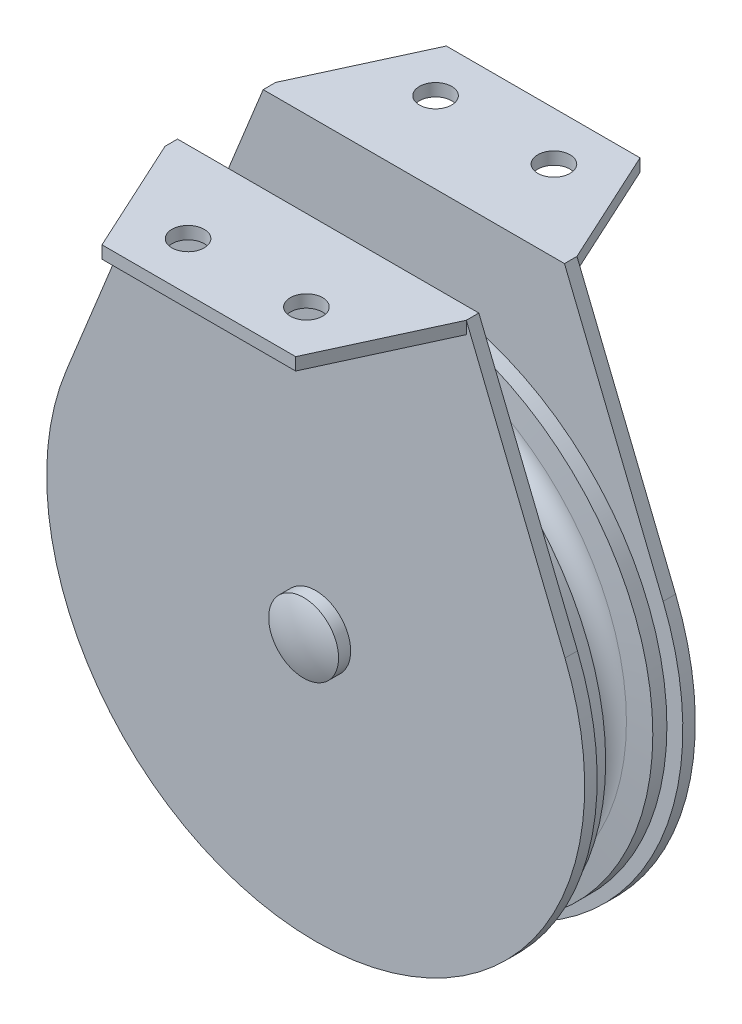
ISO-10303-21;
HEADER;
FILE_DESCRIPTION(('STEP AP214'),'2;1');
FILE_NAME('part.step','',(''),(''),'','','');
FILE_SCHEMA(('AUTOMOTIVE_DESIGN { 1 0 10303 214 1 1 1 1 }'));
ENDSEC;
DATA;
#1=APPLICATION_CONTEXT('core data for automotive mechanical design processes');
#2=APPLICATION_PROTOCOL_DEFINITION('international standard','automotive_design',2000,#1);
#3=PRODUCT_CONTEXT('',#1,'mechanical');
#4=PRODUCT('Part','Part','',(#3));
#5=PRODUCT_RELATED_PRODUCT_CATEGORY('part','',(#4));
#6=PRODUCT_DEFINITION_FORMATION('','',#4);
#7=PRODUCT_DEFINITION_CONTEXT('part definition',#1,'design');
#8=PRODUCT_DEFINITION('design','',#6,#7);
#9=PRODUCT_DEFINITION_SHAPE('','',#8);
#10=(LENGTH_UNIT() NAMED_UNIT(*) SI_UNIT(.MILLI.,.METRE.));
#11=(NAMED_UNIT(*) PLANE_ANGLE_UNIT() SI_UNIT($,.RADIAN.));
#12=(NAMED_UNIT(*) SI_UNIT($,.STERADIAN.) SOLID_ANGLE_UNIT());
#13=UNCERTAINTY_MEASURE_WITH_UNIT(LENGTH_MEASURE(1.E-05),#10,'distance_accuracy_value','');
#14=(GEOMETRIC_REPRESENTATION_CONTEXT(3) GLOBAL_UNCERTAINTY_ASSIGNED_CONTEXT((#13)) GLOBAL_UNIT_ASSIGNED_CONTEXT((#10,
#11,#12)) REPRESENTATION_CONTEXT('',''));
#15=CARTESIAN_POINT('',(0.,0.,0.));
#16=DIRECTION('',(0.,0.,1.));
#17=DIRECTION('',(1.,0.,0.));
#18=AXIS2_PLACEMENT_3D('',#15,#16,#17);
#19=CARTESIAN_POINT('',(0.,0.,-9.93775));
#20=DIRECTION('',(0.,0.,1.));
#21=DIRECTION('',(1.,0.,0.));
#22=AXIS2_PLACEMENT_3D('',#19,#20,#21);
#23=CYLINDRICAL_SURFACE('',#22,6.35);
#24=CARTESIAN_POINT('',(0.,0.,-9.93775));
#25=DIRECTION('',(0.,0.,-1.));
#26=DIRECTION('',(-1.,0.,0.));
#27=AXIS2_PLACEMENT_3D('',#24,#25,#26);
#28=CIRCLE('',#27,6.35);
#29=CARTESIAN_POINT('',(-6.35,0.,-9.93775));
#30=VERTEX_POINT('',#29);
#31=EDGE_CURVE('E11',#30,#30,#28,.T.);
#32=ORIENTED_EDGE('',*,*,#31,.F.);
#33=EDGE_LOOP('',(#32));
#34=FACE_BOUND('',#33,.T.);
#35=CARTESIAN_POINT('',(0.,0.,-8.15975));
#36=DIRECTION('',(0.,0.,-1.));
#37=DIRECTION('',(-1.,0.,0.));
#38=AXIS2_PLACEMENT_3D('',#35,#36,#37);
#39=CIRCLE('',#38,6.35);
#40=CARTESIAN_POINT('',(-6.35,0.,-8.15975));
#41=VERTEX_POINT('',#40);
#42=EDGE_CURVE('E50',#41,#41,#39,.T.);
#43=ORIENTED_EDGE('',*,*,#42,.T.);
#44=EDGE_LOOP('',(#43));
#45=FACE_BOUND('',#44,.T.);
#46=ADVANCED_FACE('F43',(#34,#45),#23,.T.);
#47=CARTESIAN_POINT('',(0.,0.,-6.83080897435898));
#48=DIRECTION('',(0.,0.,1.));
#49=DIRECTION('',(1.,0.,0.));
#50=AXIS2_PLACEMENT_3D('',#47,#48,#49);
#51=SPHERICAL_SURFACE('',#50,7.06934102564103);
#52=ORIENTED_EDGE('',*,*,#31,.T.);
#53=EDGE_LOOP('',(#52));
#54=FACE_BOUND('',#53,.T.);
#55=ADVANCED_FACE('F45',(#54),#51,.T.);
#56=CARTESIAN_POINT('',(0.,0.,-8.15975));
#57=DIRECTION('',(0.,0.,-1.));
#58=DIRECTION('',(-1.,0.,0.));
#59=AXIS2_PLACEMENT_3D('',#56,#57,#58);
#60=PLANE('',#59);
#61=ORIENTED_EDGE('',*,*,#42,.F.);
#62=EDGE_LOOP('',(#61));
#63=FACE_BOUND('',#62,.T.);
#64=ADVANCED_FACE('F57',(#63),#60,.F.);
#65=CLOSED_SHELL('',(#46,#55,#64));
#66=MANIFOLD_SOLID_BREP('B2',#65);
#67=CARTESIAN_POINT('',(-22.225,50.8,-8.15975));
#68=DIRECTION('',(0.926691720270189,-0.375822372381793,0.));
#69=DIRECTION('',(0.375822372381793,0.926691720270189,0.));
#70=AXIS2_PLACEMENT_3D('',#67,#68,#69);
#71=PLANE('',#70);
#72=DIRECTION('',(-0.375822372381793,-0.926691720270188,0.));
#73=VECTOR('',#72,1.);
#74=CARTESIAN_POINT('',(-22.225,50.8,-6.31825));
#75=LINE('',#74,#73);
#76=CARTESIAN_POINT('',(-22.225,50.8,-6.31825));
#77=VERTEX_POINT('',#76);
#78=CARTESIAN_POINT('',(-36.7780776482231,14.9154504039024,-6.31825));
#79=VERTEX_POINT('',#78);
#80=EDGE_CURVE('E171',#77,#79,#75,.T.);
#81=ORIENTED_EDGE('',*,*,#80,.F.);
#82=DIRECTION('',(0.,0.,1.));
#83=VECTOR('',#82,1.);
#84=CARTESIAN_POINT('',(-22.225,50.8,-8.15975));
#85=LINE('',#84,#83);
#86=CARTESIAN_POINT('',(-22.225,50.8,-8.15975));
#87=VERTEX_POINT('',#86);
#88=EDGE_CURVE('E209',#87,#77,#85,.T.);
#89=ORIENTED_EDGE('',*,*,#88,.F.);
#90=DIRECTION('',(-0.375822372381793,-0.926691720270188,0.));
#91=VECTOR('',#90,1.);
#92=CARTESIAN_POINT('',(-22.225,50.8,-8.15975));
#93=LINE('',#92,#91);
#94=CARTESIAN_POINT('',(-36.7780776482231,14.9154504039024,-8.15975));
#95=VERTEX_POINT('',#94);
#96=EDGE_CURVE('E202',#87,#95,#93,.T.);
#97=ORIENTED_EDGE('',*,*,#96,.T.);
#98=DIRECTION('',(0.,0.,1.));
#99=VECTOR('',#98,1.);
#100=CARTESIAN_POINT('',(-36.7780776482231,14.9154504039024,-8.15975));
#101=LINE('',#100,#99);
#102=EDGE_CURVE('E41',#95,#79,#101,.T.);
#103=ORIENTED_EDGE('',*,*,#102,.T.);
#104=EDGE_LOOP('',(#81,#89,#97,#103));
#105=FACE_BOUND('',#104,.T.);
#106=ADVANCED_FACE('F92',(#105),#71,.F.);
#107=CARTESIAN_POINT('',(0.,0.,-8.15975));
#108=DIRECTION('',(0.,0.,1.));
#109=DIRECTION('',(-1.,0.,0.));
#110=AXIS2_PLACEMENT_3D('',#107,#108,#109);
#111=CYLINDRICAL_SURFACE('',#110,39.6875);
#112=CARTESIAN_POINT('',(0.,0.,-6.31825));
#113=DIRECTION('',(0.,0.,1.));
#114=DIRECTION('',(1.,0.,0.));
#115=AXIS2_PLACEMENT_3D('',#112,#113,#114);
#116=CIRCLE('',#115,39.6875);
#117=CARTESIAN_POINT('',(36.7780776482231,14.9154504039024,-6.31825));
#118=VERTEX_POINT('',#117);
#119=EDGE_CURVE('E211',#79,#118,#116,.T.);
#120=ORIENTED_EDGE('',*,*,#119,.F.);
#121=ORIENTED_EDGE('',*,*,#102,.F.);
#122=CARTESIAN_POINT('',(0.,0.,-8.15975));
#123=DIRECTION('',(0.,0.,1.));
#124=DIRECTION('',(1.,0.,0.));
#125=AXIS2_PLACEMENT_3D('',#122,#123,#124);
#126=CIRCLE('',#125,39.6875);
#127=CARTESIAN_POINT('',(36.7780776482231,14.9154504039024,-8.15975));
#128=VERTEX_POINT('',#127);
#129=EDGE_CURVE('E136',#95,#128,#126,.T.);
#130=ORIENTED_EDGE('',*,*,#129,.T.);
#131=DIRECTION('',(0.,0.,1.));
#132=VECTOR('',#131,1.);
#133=CARTESIAN_POINT('',(36.7780776482231,14.9154504039024,-8.15975));
#134=LINE('',#133,#132);
#135=EDGE_CURVE('E100',#128,#118,#134,.T.);
#136=ORIENTED_EDGE('',*,*,#135,.T.);
#137=EDGE_LOOP('',(#120,#121,#130,#136));
#138=FACE_BOUND('',#137,.T.);
#139=ADVANCED_FACE('F222',(#138),#111,.T.);
#140=CARTESIAN_POINT('',(36.7780776482231,14.9154504039024,-8.15975));
#141=DIRECTION('',(-0.926691720270189,-0.375822372381793,0.));
#142=DIRECTION('',(0.375822372381793,-0.926691720270189,0.));
#143=AXIS2_PLACEMENT_3D('',#140,#141,#142);
#144=PLANE('',#143);
#145=DIRECTION('',(-0.375822372381792,0.926691720270188,0.));
#146=VECTOR('',#145,1.);
#147=CARTESIAN_POINT('',(36.7780776482231,14.9154504039024,-6.31825));
#148=LINE('',#147,#146);
#149=CARTESIAN_POINT('',(22.225,50.8,-6.31825));
#150=VERTEX_POINT('',#149);
#151=EDGE_CURVE('E214',#118,#150,#148,.T.);
#152=ORIENTED_EDGE('',*,*,#151,.F.);
#153=ORIENTED_EDGE('',*,*,#135,.F.);
#154=DIRECTION('',(-0.375822372381792,0.926691720270188,0.));
#155=VECTOR('',#154,1.);
#156=CARTESIAN_POINT('',(36.7780776482231,14.9154504039024,-8.15975));
#157=LINE('',#156,#155);
#158=CARTESIAN_POINT('',(22.225,50.8,-8.15975000000001));
#159=VERTEX_POINT('',#158);
#160=EDGE_CURVE('E206',#128,#159,#157,.T.);
#161=ORIENTED_EDGE('',*,*,#160,.T.);
#162=DIRECTION('',(0.,0.,1.));
#163=VECTOR('',#162,1.);
#164=CARTESIAN_POINT('',(22.225,50.8,-8.15975));
#165=LINE('',#164,#163);
#166=EDGE_CURVE('E218',#159,#150,#165,.T.);
#167=ORIENTED_EDGE('',*,*,#166,.T.);
#168=EDGE_LOOP('',(#152,#153,#161,#167));
#169=FACE_BOUND('',#168,.T.);
#170=ADVANCED_FACE('F231',(#169),#144,.F.);
#171=CARTESIAN_POINT('',(22.225,50.8,-8.15975));
#172=DIRECTION('',(0.,-1.,0.));
#173=DIRECTION('',(0.,0.,1.));
#174=AXIS2_PLACEMENT_3D('',#171,#172,#173);
#175=PLANE('',#174);
#176=DIRECTION('',(-1.,0.,0.));
#177=VECTOR('',#176,1.);
#178=CARTESIAN_POINT('',(22.225,50.8,-6.31825));
#179=LINE('',#178,#177);
#180=EDGE_CURVE('E127',#150,#77,#179,.T.);
#181=ORIENTED_EDGE('',*,*,#180,.F.);
#182=ORIENTED_EDGE('',*,*,#166,.F.);
#183=DIRECTION('',(-0.418209335464118,0.,-0.908350676628064));
#184=VECTOR('',#183,1.);
#185=CARTESIAN_POINT('',(14.2875,50.8,-25.4));
#186=LINE('',#185,#184);
#187=CARTESIAN_POINT('',(14.2875,50.8,-25.4));
#188=VERTEX_POINT('',#187);
#189=EDGE_CURVE('E195',#159,#188,#186,.T.);
#190=ORIENTED_EDGE('',*,*,#189,.T.);
#191=DIRECTION('',(-1.,0.,0.));
#192=VECTOR('',#191,1.);
#193=CARTESIAN_POINT('',(14.2875,50.8,-25.4));
#194=LINE('',#193,#192);
#195=CARTESIAN_POINT('',(-14.2875,50.8,-25.4));
#196=VERTEX_POINT('',#195);
#197=EDGE_CURVE('E166',#188,#196,#194,.T.);
#198=ORIENTED_EDGE('',*,*,#197,.T.);
#199=DIRECTION('',(-0.418209335464118,0.,0.908350676628064));
#200=VECTOR('',#199,1.);
#201=CARTESIAN_POINT('',(-14.2875,50.8,-25.4));
#202=LINE('',#201,#200);
#203=EDGE_CURVE('E185',#196,#87,#202,.T.);
#204=ORIENTED_EDGE('',*,*,#203,.T.);
#205=ORIENTED_EDGE('',*,*,#88,.T.);
#206=EDGE_LOOP('',(#181,#182,#190,#198,#204,#205));
#207=FACE_BOUND('',#206,.T.);
#208=CARTESIAN_POINT('',(8.73125,50.8,-18.25625));
#209=DIRECTION('',(0.,1.,0.));
#210=DIRECTION('',(0.,0.,1.));
#211=AXIS2_PLACEMENT_3D('',#208,#209,#210);
#212=CIRCLE('',#211,2.38125);
#213=CARTESIAN_POINT('',(8.73125,50.8,-15.875));
#214=VERTEX_POINT('',#213);
#215=EDGE_CURVE('E189',#214,#214,#212,.T.);
#216=ORIENTED_EDGE('',*,*,#215,.F.);
#217=EDGE_LOOP('',(#216));
#218=FACE_BOUND('',#217,.T.);
#219=CARTESIAN_POINT('',(-8.73125,50.8,-18.25625));
#220=DIRECTION('',(0.,1.,0.));
#221=DIRECTION('',(0.,0.,1.));
#222=AXIS2_PLACEMENT_3D('',#219,#220,#221);
#223=CIRCLE('',#222,2.38125);
#224=CARTESIAN_POINT('',(-8.73125,50.8,-15.875));
#225=VERTEX_POINT('',#224);
#226=EDGE_CURVE('E337',#225,#225,#223,.T.);
#227=ORIENTED_EDGE('',*,*,#226,.F.);
#228=EDGE_LOOP('',(#227));
#229=FACE_BOUND('',#228,.T.);
#230=ADVANCED_FACE('F229',(#207,#218,#229),#175,.F.);
#231=CARTESIAN_POINT('',(0.,0.,-8.15975));
#232=DIRECTION('',(0.,0.,-1.));
#233=DIRECTION('',(1.,0.,0.));
#234=AXIS2_PLACEMENT_3D('',#231,#232,#233);
#235=PLANE('',#234);
#236=DIRECTION('',(0.,1.,0.));
#237=VECTOR('',#236,1.);
#238=CARTESIAN_POINT('',(22.225,48.9585,-8.15975000000001));
#239=LINE('',#238,#237);
#240=CARTESIAN_POINT('',(22.225,48.9585,-8.15975000000001));
#241=VERTEX_POINT('',#240);
#242=EDGE_CURVE('E184',#241,#159,#239,.T.);
#243=ORIENTED_EDGE('',*,*,#242,.T.);
#244=ORIENTED_EDGE('',*,*,#160,.F.);
#245=ORIENTED_EDGE('',*,*,#129,.F.);
#246=ORIENTED_EDGE('',*,*,#96,.F.);
#247=DIRECTION('',(0.,1.,0.));
#248=VECTOR('',#247,1.);
#249=CARTESIAN_POINT('',(-22.225,48.9585,-8.15975000000001));
#250=LINE('',#249,#248);
#251=CARTESIAN_POINT('',(-22.225,48.9585,-8.15975000000001));
#252=VERTEX_POINT('',#251);
#253=EDGE_CURVE('E108',#252,#87,#250,.T.);
#254=ORIENTED_EDGE('',*,*,#253,.F.);
#255=DIRECTION('',(1.,0.,0.));
#256=VECTOR('',#255,1.);
#257=CARTESIAN_POINT('',(22.225,48.9585,-8.15975000000001));
#258=LINE('',#257,#256);
#259=EDGE_CURVE('E193',#252,#241,#258,.T.);
#260=ORIENTED_EDGE('',*,*,#259,.T.);
#261=EDGE_LOOP('',(#243,#244,#245,#246,#254,#260));
#262=FACE_BOUND('',#261,.T.);
#263=ADVANCED_FACE('F228',(#262),#235,.T.);
#264=CARTESIAN_POINT('',(0.,0.,-6.31825));
#265=DIRECTION('',(0.,0.,-1.));
#266=DIRECTION('',(1.,0.,0.));
#267=AXIS2_PLACEMENT_3D('',#264,#265,#266);
#268=PLANE('',#267);
#269=ORIENTED_EDGE('',*,*,#80,.T.);
#270=ORIENTED_EDGE('',*,*,#119,.T.);
#271=ORIENTED_EDGE('',*,*,#151,.T.);
#272=ORIENTED_EDGE('',*,*,#180,.T.);
#273=EDGE_LOOP('',(#269,#270,#271,#272));
#274=FACE_BOUND('',#273,.T.);
#275=ADVANCED_FACE('F224',(#274),#268,.F.);
#276=CARTESIAN_POINT('',(22.225,48.9585,-8.15975000000001));
#277=DIRECTION('',(0.,1.,0.));
#278=DIRECTION('',(0.,0.,-1.));
#279=AXIS2_PLACEMENT_3D('',#276,#277,#278);
#280=PLANE('',#279);
#281=CARTESIAN_POINT('',(8.73125,48.9585,-18.25625));
#282=DIRECTION('',(0.,1.,0.));
#283=DIRECTION('',(0.,0.,1.));
#284=AXIS2_PLACEMENT_3D('',#281,#282,#283);
#285=CIRCLE('',#284,2.38125);
#286=CARTESIAN_POINT('',(8.73125,48.9585,-15.875));
#287=VERTEX_POINT('',#286);
#288=EDGE_CURVE('E197',#287,#287,#285,.T.);
#289=ORIENTED_EDGE('',*,*,#288,.T.);
#290=EDGE_LOOP('',(#289));
#291=FACE_BOUND('',#290,.T.);
#292=DIRECTION('',(-0.418209335464118,0.,-0.908350676628064));
#293=VECTOR('',#292,1.);
#294=CARTESIAN_POINT('',(14.2875,48.9585,-25.4));
#295=LINE('',#294,#293);
#296=CARTESIAN_POINT('',(14.2875,48.9585,-25.4));
#297=VERTEX_POINT('',#296);
#298=EDGE_CURVE('E178',#241,#297,#295,.T.);
#299=ORIENTED_EDGE('',*,*,#298,.F.);
#300=ORIENTED_EDGE('',*,*,#259,.F.);
#301=DIRECTION('',(-0.418209335464118,0.,0.908350676628064));
#302=VECTOR('',#301,1.);
#303=CARTESIAN_POINT('',(-14.2875,48.9585,-25.4));
#304=LINE('',#303,#302);
#305=CARTESIAN_POINT('',(-14.2875,48.9585,-25.4));
#306=VERTEX_POINT('',#305);
#307=EDGE_CURVE('E180',#306,#252,#304,.T.);
#308=ORIENTED_EDGE('',*,*,#307,.F.);
#309=DIRECTION('',(-1.,0.,0.));
#310=VECTOR('',#309,1.);
#311=CARTESIAN_POINT('',(14.2875,48.9585,-25.4));
#312=LINE('',#311,#310);
#313=EDGE_CURVE('E163',#297,#306,#312,.T.);
#314=ORIENTED_EDGE('',*,*,#313,.F.);
#315=EDGE_LOOP('',(#299,#300,#308,#314));
#316=FACE_BOUND('',#315,.T.);
#317=CARTESIAN_POINT('',(-8.73125,48.9585,-18.25625));
#318=DIRECTION('',(0.,1.,0.));
#319=DIRECTION('',(0.,0.,1.));
#320=AXIS2_PLACEMENT_3D('',#317,#318,#319);
#321=CIRCLE('',#320,2.38125);
#322=CARTESIAN_POINT('',(-8.73125,48.9585,-15.875));
#323=VERTEX_POINT('',#322);
#324=EDGE_CURVE('E334',#323,#323,#321,.T.);
#325=ORIENTED_EDGE('',*,*,#324,.T.);
#326=EDGE_LOOP('',(#325));
#327=FACE_BOUND('',#326,.T.);
#328=ADVANCED_FACE('F175',(#291,#316,#327),#280,.F.);
#329=CARTESIAN_POINT('',(14.2875,48.9585,-25.4));
#330=DIRECTION('',(-0.908350676628064,0.,0.418209335464118));
#331=DIRECTION('',(-0.418209335464118,0.,-0.908350676628064));
#332=AXIS2_PLACEMENT_3D('',#329,#330,#331);
#333=PLANE('',#332);
#334=ORIENTED_EDGE('',*,*,#189,.F.);
#335=ORIENTED_EDGE('',*,*,#242,.F.);
#336=ORIENTED_EDGE('',*,*,#298,.T.);
#337=DIRECTION('',(0.,1.,0.));
#338=VECTOR('',#337,1.);
#339=CARTESIAN_POINT('',(14.2875,48.9585,-25.4));
#340=LINE('',#339,#338);
#341=EDGE_CURVE('E160',#297,#188,#340,.T.);
#342=ORIENTED_EDGE('',*,*,#341,.T.);
#343=EDGE_LOOP('',(#334,#335,#336,#342));
#344=FACE_BOUND('',#343,.T.);
#345=ADVANCED_FACE('F183',(#344),#333,.F.);
#346=CARTESIAN_POINT('',(14.2875,48.9585,-25.4));
#347=DIRECTION('',(0.,0.,1.));
#348=DIRECTION('',(-1.,0.,0.));
#349=AXIS2_PLACEMENT_3D('',#346,#347,#348);
#350=PLANE('',#349);
#351=ORIENTED_EDGE('',*,*,#197,.F.);
#352=ORIENTED_EDGE('',*,*,#341,.F.);
#353=ORIENTED_EDGE('',*,*,#313,.T.);
#354=DIRECTION('',(0.,1.,0.));
#355=VECTOR('',#354,1.);
#356=CARTESIAN_POINT('',(-14.2875,48.9585,-25.4));
#357=LINE('',#356,#355);
#358=EDGE_CURVE('E172',#306,#196,#357,.T.);
#359=ORIENTED_EDGE('',*,*,#358,.T.);
#360=EDGE_LOOP('',(#351,#352,#353,#359));
#361=FACE_BOUND('',#360,.T.);
#362=ADVANCED_FACE('F162',(#361),#350,.F.);
#363=CARTESIAN_POINT('',(-14.2875,48.9585,-25.4));
#364=DIRECTION('',(0.908350676628064,0.,0.418209335464118));
#365=DIRECTION('',(-0.418209335464118,0.,0.908350676628064));
#366=AXIS2_PLACEMENT_3D('',#363,#364,#365);
#367=PLANE('',#366);
#368=ORIENTED_EDGE('',*,*,#203,.F.);
#369=ORIENTED_EDGE('',*,*,#358,.F.);
#370=ORIENTED_EDGE('',*,*,#307,.T.);
#371=ORIENTED_EDGE('',*,*,#253,.T.);
#372=EDGE_LOOP('',(#368,#369,#370,#371));
#373=FACE_BOUND('',#372,.T.);
#374=ADVANCED_FACE('F299',(#373),#367,.F.);
#375=CARTESIAN_POINT('',(8.73125,48.9585,-18.25625));
#376=DIRECTION('',(0.,1.,0.));
#377=DIRECTION('',(0.,0.,-1.));
#378=AXIS2_PLACEMENT_3D('',#375,#376,#377);
#379=CYLINDRICAL_SURFACE('',#378,2.38125);
#380=ORIENTED_EDGE('',*,*,#288,.F.);
#381=EDGE_LOOP('',(#380));
#382=FACE_BOUND('',#381,.T.);
#383=ORIENTED_EDGE('',*,*,#215,.T.);
#384=EDGE_LOOP('',(#383));
#385=FACE_BOUND('',#384,.T.);
#386=ADVANCED_FACE('F308',(#382,#385),#379,.F.);
#387=CARTESIAN_POINT('',(-8.73125,48.9585,-18.25625));
#388=DIRECTION('',(0.,1.,0.));
#389=DIRECTION('',(0.,0.,-1.));
#390=AXIS2_PLACEMENT_3D('',#387,#388,#389);
#391=CYLINDRICAL_SURFACE('',#390,2.38125);
#392=ORIENTED_EDGE('',*,*,#324,.F.);
#393=EDGE_LOOP('',(#392));
#394=FACE_BOUND('',#393,.T.);
#395=ORIENTED_EDGE('',*,*,#226,.T.);
#396=EDGE_LOOP('',(#395));
#397=FACE_BOUND('',#396,.T.);
#398=ADVANCED_FACE('F317',(#394,#397),#391,.F.);
#399=CLOSED_SHELL('',(#106,#139,#170,#230,#263,#275,#328,#345,#362,#374,#386,#398));
#400=MANIFOLD_SOLID_BREP('B6',#399);
#401=CARTESIAN_POINT('',(0.,0.,-18.2715183923239));
#402=DIRECTION('',(0.,0.,1.));
#403=DIRECTION('',(1.,0.,0.));
#404=AXIS2_PLACEMENT_3D('',#401,#402,#403);
#405=CYLINDRICAL_SURFACE('',#404,3.57505);
#406=CARTESIAN_POINT('',(0.,0.,5.55625));
#407=DIRECTION('',(0.,0.,-1.));
#408=DIRECTION('',(-1.,0.,0.));
#409=AXIS2_PLACEMENT_3D('',#406,#407,#408);
#410=CIRCLE('',#409,3.57505);
#411=CARTESIAN_POINT('',(-3.57505,0.,5.55625));
#412=VERTEX_POINT('',#411);
#413=EDGE_CURVE('E484',#412,#412,#410,.T.);
#414=ORIENTED_EDGE('',*,*,#413,.F.);
#415=EDGE_LOOP('',(#414));
#416=FACE_BOUND('',#415,.T.);
#417=CARTESIAN_POINT('',(0.,0.,6.31825));
#418=DIRECTION('',(0.,0.,1.));
#419=DIRECTION('',(1.,0.,0.));
#420=AXIS2_PLACEMENT_3D('',#417,#418,#419);
#421=CIRCLE('',#420,3.57505);
#422=CARTESIAN_POINT('',(3.57505,0.,6.31825));
#423=VERTEX_POINT('',#422);
#424=EDGE_CURVE('E356',#423,#423,#421,.F.);
#425=ORIENTED_EDGE('',*,*,#424,.T.);
#426=EDGE_LOOP('',(#425));
#427=FACE_BOUND('',#426,.T.);
#428=ADVANCED_FACE('F352',(#416,#427),#405,.T.);
#429=CARTESIAN_POINT('',(0.,0.,5.55625));
#430=DIRECTION('',(0.,0.,1.));
#431=DIRECTION('',(1.,0.,0.));
#432=AXIS2_PLACEMENT_3D('',#429,#430,#431);
#433=CYLINDRICAL_SURFACE('',#432,38.1);
#434=CARTESIAN_POINT('',(0.,0.,5.55625));
#435=DIRECTION('',(0.,0.,1.));
#436=DIRECTION('',(1.,0.,0.));
#437=AXIS2_PLACEMENT_3D('',#434,#435,#436);
#438=CIRCLE('',#437,38.1);
#439=CARTESIAN_POINT('',(38.1,0.,5.55625));
#440=VERTEX_POINT('',#439);
#441=EDGE_CURVE('E488',#440,#440,#438,.T.);
#442=ORIENTED_EDGE('',*,*,#441,.F.);
#443=EDGE_LOOP('',(#442));
#444=FACE_BOUND('',#443,.T.);
#445=CARTESIAN_POINT('',(0.,0.,3.47601555116273));
#446=DIRECTION('',(0.,0.,1.));
#447=DIRECTION('',(1.,0.,0.));
#448=AXIS2_PLACEMENT_3D('',#445,#446,#447);
#449=CIRCLE('',#448,38.1);
#450=CARTESIAN_POINT('',(38.1,0.,3.47601555116273));
#451=VERTEX_POINT('',#450);
#452=EDGE_CURVE('E90',#451,#451,#449,.T.);
#453=ORIENTED_EDGE('',*,*,#452,.T.);
#454=EDGE_LOOP('',(#453));
#455=FACE_BOUND('',#454,.T.);
#456=ADVANCED_FACE('F354',(#444,#455),#433,.T.);
#457=CARTESIAN_POINT('',(0.,0.,3.16291816644129));
#458=DIRECTION('',(0.,0.,1.));
#459=DIRECTION('',(1.,0.,0.));
#460=AXIS2_PLACEMENT_3D('',#457,#458,#459);
#461=CONICAL_SURFACE('',#460,34.5212805167762,1.48352986419518);
#462=ORIENTED_EDGE('',*,*,#452,.F.);
#463=EDGE_LOOP('',(#462));
#464=FACE_BOUND('',#463,.T.);
#465=CARTESIAN_POINT('',(0.,0.,3.16291816644129));
#466=DIRECTION('',(0.,0.,1.));
#467=DIRECTION('',(1.,0.,0.));
#468=AXIS2_PLACEMENT_3D('',#465,#466,#467);
#469=CIRCLE('',#468,34.5212805167762);
#470=CARTESIAN_POINT('',(34.5212805167762,0.,3.16291816644129));
#471=VERTEX_POINT('',#470);
#472=EDGE_CURVE('E362',#471,#471,#469,.T.);
#473=ORIENTED_EDGE('',*,*,#472,.T.);
#474=EDGE_LOOP('',(#473));
#475=FACE_BOUND('',#474,.T.);
#476=ADVANCED_FACE('F598',(#464,#475),#461,.T.);
#477=CARTESIAN_POINT('',(0.,0.,0.));
#478=DIRECTION('',(0.,0.,1.));
#479=DIRECTION('',(1.,0.,0.));
#480=AXIS2_PLACEMENT_3D('',#477,#478,#479);
#481=TOROIDAL_SURFACE('',#480,34.798,3.175);
#482=ORIENTED_EDGE('',*,*,#472,.F.);
#483=EDGE_LOOP('',(#482));
#484=FACE_BOUND('',#483,.T.);
#485=CARTESIAN_POINT('',(0.,0.,-3.16291816644129));
#486=DIRECTION('',(0.,0.,1.));
#487=DIRECTION('',(1.,0.,0.));
#488=AXIS2_PLACEMENT_3D('',#485,#486,#487);
#489=CIRCLE('',#488,34.5212805167762);
#490=CARTESIAN_POINT('',(34.5212805167762,0.,-3.16291816644129));
#491=VERTEX_POINT('',#490);
#492=EDGE_CURVE('E497',#491,#491,#489,.T.);
#493=ORIENTED_EDGE('',*,*,#492,.T.);
#494=EDGE_LOOP('',(#493));
#495=FACE_BOUND('',#494,.T.);
#496=ADVANCED_FACE('F595',(#484,#495),#481,.F.);
#497=CARTESIAN_POINT('',(0.,0.,-3.47601555116273));
#498=DIRECTION('',(0.,0.,-1.));
#499=DIRECTION('',(-1.,0.,0.));
#500=AXIS2_PLACEMENT_3D('',#497,#498,#499);
#501=CONICAL_SURFACE('',#500,38.1,1.48352986419518);
#502=ORIENTED_EDGE('',*,*,#492,.F.);
#503=EDGE_LOOP('',(#502));
#504=FACE_BOUND('',#503,.T.);
#505=CARTESIAN_POINT('',(0.,0.,-3.47601555116273));
#506=DIRECTION('',(0.,0.,1.));
#507=DIRECTION('',(1.,0.,0.));
#508=AXIS2_PLACEMENT_3D('',#505,#506,#507);
#509=CIRCLE('',#508,38.1);
#510=CARTESIAN_POINT('',(38.1,0.,-3.47601555116273));
#511=VERTEX_POINT('',#510);
#512=EDGE_CURVE('E494',#511,#511,#509,.T.);
#513=ORIENTED_EDGE('',*,*,#512,.T.);
#514=EDGE_LOOP('',(#513));
#515=FACE_BOUND('',#514,.T.);
#516=ADVANCED_FACE('F591',(#504,#515),#501,.T.);
#517=CARTESIAN_POINT('',(0.,0.,5.55625));
#518=DIRECTION('',(0.,0.,1.));
#519=DIRECTION('',(1.,0.,0.));
#520=AXIS2_PLACEMENT_3D('',#517,#518,#519);
#521=CYLINDRICAL_SURFACE('',#520,38.1);
#522=ORIENTED_EDGE('',*,*,#512,.F.);
#523=EDGE_LOOP('',(#522));
#524=FACE_BOUND('',#523,.T.);
#525=CARTESIAN_POINT('',(0.,0.,-5.55625));
#526=DIRECTION('',(0.,0.,1.));
#527=DIRECTION('',(1.,0.,0.));
#528=AXIS2_PLACEMENT_3D('',#525,#526,#527);
#529=CIRCLE('',#528,38.1);
#530=CARTESIAN_POINT('',(38.1,0.,-5.55625));
#531=VERTEX_POINT('',#530);
#532=EDGE_CURVE('E491',#531,#531,#529,.T.);
#533=ORIENTED_EDGE('',*,*,#532,.T.);
#534=EDGE_LOOP('',(#533));
#535=FACE_BOUND('',#534,.T.);
#536=ADVANCED_FACE('F587',(#524,#535),#521,.T.);
#537=CARTESIAN_POINT('',(0.,0.,-5.55625));
#538=DIRECTION('',(0.,0.,1.));
#539=DIRECTION('',(1.,0.,0.));
#540=AXIS2_PLACEMENT_3D('',#537,#538,#539);
#541=PLANE('',#540);
#542=CARTESIAN_POINT('',(0.,0.,-5.55625));
#543=DIRECTION('',(0.,0.,1.));
#544=DIRECTION('',(1.,0.,0.));
#545=AXIS2_PLACEMENT_3D('',#542,#543,#544);
#546=CIRCLE('',#545,3.57505);
#547=CARTESIAN_POINT('',(3.57505,0.,-5.55625));
#548=VERTEX_POINT('',#547);
#549=EDGE_CURVE('E485',#548,#548,#546,.T.);
#550=ORIENTED_EDGE('',*,*,#549,.T.);
#551=EDGE_LOOP('',(#550));
#552=FACE_BOUND('',#551,.T.);
#553=ORIENTED_EDGE('',*,*,#532,.F.);
#554=EDGE_LOOP('',(#553));
#555=FACE_BOUND('',#554,.T.);
#556=ADVANCED_FACE('F584',(#552,#555),#541,.F.);
#557=CARTESIAN_POINT('',(0.,38.1,5.55625));
#558=DIRECTION('',(0.,0.,-1.));
#559=DIRECTION('',(-1.,0.,0.));
#560=AXIS2_PLACEMENT_3D('',#557,#558,#559);
#561=PLANE('',#560);
#562=ORIENTED_EDGE('',*,*,#413,.T.);
#563=EDGE_LOOP('',(#562));
#564=FACE_BOUND('',#563,.T.);
#565=ORIENTED_EDGE('',*,*,#441,.T.);
#566=EDGE_LOOP('',(#565));
#567=FACE_BOUND('',#566,.T.);
#568=ADVANCED_FACE('F504',(#564,#567),#561,.F.);
#569=CARTESIAN_POINT('',(0.,0.,-8.15975));
#570=DIRECTION('',(0.,0.,-1.));
#571=DIRECTION('',(-1.,0.,0.));
#572=AXIS2_PLACEMENT_3D('',#569,#570,#571);
#573=CIRCLE('',#572,3.57505);
#574=CARTESIAN_POINT('',(-3.57505,0.,-8.15975));
#575=VERTEX_POINT('',#574);
#576=EDGE_CURVE('E481',#575,#575,#573,.F.);
#577=ORIENTED_EDGE('',*,*,#576,.T.);
#578=EDGE_LOOP('',(#577));
#579=FACE_BOUND('',#578,.T.);
#580=ORIENTED_EDGE('',*,*,#549,.F.);
#581=EDGE_LOOP('',(#580));
#582=FACE_BOUND('',#581,.T.);
#583=ADVANCED_FACE('F510',(#579,#582),#405,.T.);
#584=CARTESIAN_POINT('',(0.,0.,-8.15975));
#585=DIRECTION('',(0.,0.,-1.));
#586=DIRECTION('',(1.,0.,0.));
#587=AXIS2_PLACEMENT_3D('',#584,#585,#586);
#588=PLANE('',#587);
#589=ORIENTED_EDGE('',*,*,#576,.F.);
#590=EDGE_LOOP('',(#589));
#591=FACE_BOUND('',#590,.T.);
#592=ADVANCED_FACE('F556',(#591),#588,.T.);
#593=CARTESIAN_POINT('',(0.,0.,8.15975));
#594=DIRECTION('',(0.,0.,1.));
#595=DIRECTION('',(1.,0.,0.));
#596=AXIS2_PLACEMENT_3D('',#593,#594,#595);
#597=PLANE('',#596);
#598=DIRECTION('',(0.,1.,0.));
#599=VECTOR('',#598,1.);
#600=CARTESIAN_POINT('',(22.225,48.9585,8.15975000000001));
#601=LINE('',#600,#599);
#602=CARTESIAN_POINT('',(22.225,48.9585,8.15975000000001));
#603=VERTEX_POINT('',#602);
#604=CARTESIAN_POINT('',(22.225,50.8,8.15975000000001));
#605=VERTEX_POINT('',#604);
#606=EDGE_CURVE('E530',#603,#605,#601,.T.);
#607=ORIENTED_EDGE('',*,*,#606,.F.);
#608=DIRECTION('',(1.,0.,0.));
#609=VECTOR('',#608,1.);
#610=CARTESIAN_POINT('',(22.225,48.9585,8.15975000000001));
#611=LINE('',#610,#609);
#612=CARTESIAN_POINT('',(-22.225,48.9585,8.15975000000001));
#613=VERTEX_POINT('',#612);
#614=EDGE_CURVE('E443',#613,#603,#611,.T.);
#615=ORIENTED_EDGE('',*,*,#614,.F.);
#616=DIRECTION('',(0.,1.,0.));
#617=VECTOR('',#616,1.);
#618=CARTESIAN_POINT('',(-22.225,48.9585,8.15975000000001));
#619=LINE('',#618,#617);
#620=CARTESIAN_POINT('',(-22.225,50.8,8.15975));
#621=VERTEX_POINT('',#620);
#622=EDGE_CURVE('E455',#613,#621,#619,.T.);
#623=ORIENTED_EDGE('',*,*,#622,.T.);
#624=DIRECTION('',(-0.375822372381793,-0.926691720270188,0.));
#625=VECTOR('',#624,1.);
#626=CARTESIAN_POINT('',(-22.225,50.8,8.15975));
#627=LINE('',#626,#625);
#628=CARTESIAN_POINT('',(-36.7780776482231,14.9154504039024,8.15975));
#629=VERTEX_POINT('',#628);
#630=EDGE_CURVE('E459',#621,#629,#627,.T.);
#631=ORIENTED_EDGE('',*,*,#630,.T.);
#632=CARTESIAN_POINT('',(0.,0.,8.15975));
#633=DIRECTION('',(0.,0.,1.));
#634=DIRECTION('',(1.,0.,0.));
#635=AXIS2_PLACEMENT_3D('',#632,#633,#634);
#636=CIRCLE('',#635,39.6875);
#637=CARTESIAN_POINT('',(36.7780776482231,14.9154504039024,8.15975));
#638=VERTEX_POINT('',#637);
#639=EDGE_CURVE('E402',#629,#638,#636,.T.);
#640=ORIENTED_EDGE('',*,*,#639,.T.);
#641=DIRECTION('',(-0.375822372381792,0.926691720270188,0.));
#642=VECTOR('',#641,1.);
#643=CARTESIAN_POINT('',(36.7780776482231,14.9154504039024,8.15975));
#644=LINE('',#643,#642);
#645=EDGE_CURVE('E462',#638,#605,#644,.T.);
#646=ORIENTED_EDGE('',*,*,#645,.T.);
#647=EDGE_LOOP('',(#607,#615,#623,#631,#640,#646));
#648=FACE_BOUND('',#647,.T.);
#649=CARTESIAN_POINT('',(0.,0.,8.15975));
#650=DIRECTION('',(0.,0.,1.));
#651=DIRECTION('',(1.,0.,0.));
#652=AXIS2_PLACEMENT_3D('',#649,#650,#651);
#653=CIRCLE('',#652,5.1562);
#654=CARTESIAN_POINT('',(5.1562,0.,8.15975));
#655=VERTEX_POINT('',#654);
#656=EDGE_CURVE('E480',#655,#655,#653,.T.);
#657=ORIENTED_EDGE('',*,*,#656,.F.);
#658=EDGE_LOOP('',(#657));
#659=FACE_BOUND('',#658,.T.);
#660=ADVANCED_FACE('F532',(#648,#659),#597,.T.);
#661=CARTESIAN_POINT('',(-22.225,50.8,8.15975));
#662=DIRECTION('',(0.926691720270189,-0.375822372381793,0.));
#663=DIRECTION('',(0.375822372381793,0.926691720270189,0.));
#664=AXIS2_PLACEMENT_3D('',#661,#662,#663);
#665=PLANE('',#664);
#666=DIRECTION('',(-0.375822372381793,-0.926691720270188,0.));
#667=VECTOR('',#666,1.);
#668=CARTESIAN_POINT('',(-22.225,50.8,6.31825));
#669=LINE('',#668,#667);
#670=CARTESIAN_POINT('',(-22.225,50.8,6.31825));
#671=VERTEX_POINT('',#670);
#672=CARTESIAN_POINT('',(-36.7780776482231,14.9154504039024,6.31825));
#673=VERTEX_POINT('',#672);
#674=EDGE_CURVE('E450',#671,#673,#669,.T.);
#675=ORIENTED_EDGE('',*,*,#674,.T.);
#676=DIRECTION('',(0.,0.,-1.));
#677=VECTOR('',#676,1.);
#678=CARTESIAN_POINT('',(-36.7780776482231,14.9154504039024,8.15975));
#679=LINE('',#678,#677);
#680=EDGE_CURVE('E474',#629,#673,#679,.T.);
#681=ORIENTED_EDGE('',*,*,#680,.F.);
#682=ORIENTED_EDGE('',*,*,#630,.F.);
#683=DIRECTION('',(0.,0.,-1.));
#684=VECTOR('',#683,1.);
#685=CARTESIAN_POINT('',(-22.225,50.8,8.15975));
#686=LINE('',#685,#684);
#687=EDGE_CURVE('E464',#621,#671,#686,.T.);
#688=ORIENTED_EDGE('',*,*,#687,.T.);
#689=EDGE_LOOP('',(#675,#681,#682,#688));
#690=FACE_BOUND('',#689,.T.);
#691=ADVANCED_FACE('F522',(#690),#665,.F.);
#692=CARTESIAN_POINT('',(0.,0.,8.15975));
#693=DIRECTION('',(0.,0.,-1.));
#694=DIRECTION('',(-1.,0.,0.));
#695=AXIS2_PLACEMENT_3D('',#692,#693,#694);
#696=CYLINDRICAL_SURFACE('',#695,39.6875);
#697=CARTESIAN_POINT('',(0.,0.,6.31825));
#698=DIRECTION('',(0.,0.,1.));
#699=DIRECTION('',(1.,0.,0.));
#700=AXIS2_PLACEMENT_3D('',#697,#698,#699);
#701=CIRCLE('',#700,39.6875);
#702=CARTESIAN_POINT('',(36.7780776482231,14.9154504039024,6.31825));
#703=VERTEX_POINT('',#702);
#704=EDGE_CURVE('E453',#673,#703,#701,.T.);
#705=ORIENTED_EDGE('',*,*,#704,.T.);
#706=DIRECTION('',(0.,0.,-1.));
#707=VECTOR('',#706,1.);
#708=CARTESIAN_POINT('',(36.7780776482231,14.9154504039024,8.15975));
#709=LINE('',#708,#707);
#710=EDGE_CURVE('E472',#638,#703,#709,.T.);
#711=ORIENTED_EDGE('',*,*,#710,.F.);
#712=ORIENTED_EDGE('',*,*,#639,.F.);
#713=ORIENTED_EDGE('',*,*,#680,.T.);
#714=EDGE_LOOP('',(#705,#711,#712,#713));
#715=FACE_BOUND('',#714,.T.);
#716=ADVANCED_FACE('F562',(#715),#696,.T.);
#717=CARTESIAN_POINT('',(36.7780776482231,14.9154504039024,8.15975));
#718=DIRECTION('',(-0.926691720270189,-0.375822372381793,0.));
#719=DIRECTION('',(0.375822372381793,-0.926691720270189,0.));
#720=AXIS2_PLACEMENT_3D('',#717,#718,#719);
#721=PLANE('',#720);
#722=DIRECTION('',(-0.375822372381792,0.926691720270188,0.));
#723=VECTOR('',#722,1.);
#724=CARTESIAN_POINT('',(36.7780776482231,14.9154504039024,6.31825));
#725=LINE('',#724,#723);
#726=CARTESIAN_POINT('',(22.225,50.8,6.31825));
#727=VERTEX_POINT('',#726);
#728=EDGE_CURVE('E390',#703,#727,#725,.T.);
#729=ORIENTED_EDGE('',*,*,#728,.T.);
#730=DIRECTION('',(0.,0.,-1.));
#731=VECTOR('',#730,1.);
#732=CARTESIAN_POINT('',(22.225,50.8,8.15975));
#733=LINE('',#732,#731);
#734=EDGE_CURVE('E470',#605,#727,#733,.T.);
#735=ORIENTED_EDGE('',*,*,#734,.F.);
#736=ORIENTED_EDGE('',*,*,#645,.F.);
#737=ORIENTED_EDGE('',*,*,#710,.T.);
#738=EDGE_LOOP('',(#729,#735,#736,#737));
#739=FACE_BOUND('',#738,.T.);
#740=ADVANCED_FACE('F571',(#739),#721,.F.);
#741=CARTESIAN_POINT('',(22.225,50.8,8.15975));
#742=DIRECTION('',(0.,-1.,0.));
#743=DIRECTION('',(0.,0.,-1.));
#744=AXIS2_PLACEMENT_3D('',#741,#742,#743);
#745=PLANE('',#744);
#746=DIRECTION('',(-1.,0.,0.));
#747=VECTOR('',#746,1.);
#748=CARTESIAN_POINT('',(22.225,50.8,6.31825));
#749=LINE('',#748,#747);
#750=EDGE_CURVE('E396',#727,#671,#749,.T.);
#751=ORIENTED_EDGE('',*,*,#750,.T.);
#752=ORIENTED_EDGE('',*,*,#687,.F.);
#753=DIRECTION('',(-0.418209335464118,0.,-0.908350676628064));
#754=VECTOR('',#753,1.);
#755=CARTESIAN_POINT('',(-14.2875,50.8,25.4));
#756=LINE('',#755,#754);
#757=CARTESIAN_POINT('',(-14.2875,50.8,25.4));
#758=VERTEX_POINT('',#757);
#759=EDGE_CURVE('E371',#758,#621,#756,.T.);
#760=ORIENTED_EDGE('',*,*,#759,.F.);
#761=DIRECTION('',(-1.,0.,0.));
#762=VECTOR('',#761,1.);
#763=CARTESIAN_POINT('',(14.2875,50.8,25.4));
#764=LINE('',#763,#762);
#765=CARTESIAN_POINT('',(14.2875,50.8,25.4));
#766=VERTEX_POINT('',#765);
#767=EDGE_CURVE('E525',#766,#758,#764,.T.);
#768=ORIENTED_EDGE('',*,*,#767,.F.);
#769=DIRECTION('',(-0.418209335464118,0.,0.908350676628064));
#770=VECTOR('',#769,1.);
#771=CARTESIAN_POINT('',(14.2875,50.8,25.4));
#772=LINE('',#771,#770);
#773=EDGE_CURVE('E449',#605,#766,#772,.T.);
#774=ORIENTED_EDGE('',*,*,#773,.F.);
#775=ORIENTED_EDGE('',*,*,#734,.T.);
#776=EDGE_LOOP('',(#751,#752,#760,#768,#774,#775));
#777=FACE_BOUND('',#776,.T.);
#778=CARTESIAN_POINT('',(8.73125,50.8,18.25625));
#779=DIRECTION('',(0.,-1.,0.));
#780=DIRECTION('',(0.,0.,-1.));
#781=AXIS2_PLACEMENT_3D('',#778,#779,#780);
#782=CIRCLE('',#781,2.38125);
#783=CARTESIAN_POINT('',(8.73125,50.8,15.875));
#784=VERTEX_POINT('',#783);
#785=EDGE_CURVE('E539',#784,#784,#782,.T.);
#786=ORIENTED_EDGE('',*,*,#785,.T.);
#787=EDGE_LOOP('',(#786));
#788=FACE_BOUND('',#787,.T.);
#789=CARTESIAN_POINT('',(-8.73125,50.8,18.25625));
#790=DIRECTION('',(0.,-1.,0.));
#791=DIRECTION('',(0.,0.,-1.));
#792=AXIS2_PLACEMENT_3D('',#789,#790,#791);
#793=CIRCLE('',#792,2.38125);
#794=CARTESIAN_POINT('',(-8.73125,50.8,15.875));
#795=VERTEX_POINT('',#794);
#796=EDGE_CURVE('E479',#795,#795,#793,.T.);
#797=ORIENTED_EDGE('',*,*,#796,.T.);
#798=EDGE_LOOP('',(#797));
#799=FACE_BOUND('',#798,.T.);
#800=ADVANCED_FACE('F517',(#777,#788,#799),#745,.F.);
#801=CARTESIAN_POINT('',(0.,0.,6.31825));
#802=DIRECTION('',(0.,0.,1.));
#803=DIRECTION('',(1.,0.,0.));
#804=AXIS2_PLACEMENT_3D('',#801,#802,#803);
#805=PLANE('',#804);
#806=ORIENTED_EDGE('',*,*,#424,.F.);
#807=EDGE_LOOP('',(#806));
#808=FACE_BOUND('',#807,.T.);
#809=ORIENTED_EDGE('',*,*,#674,.F.);
#810=ORIENTED_EDGE('',*,*,#750,.F.);
#811=ORIENTED_EDGE('',*,*,#728,.F.);
#812=ORIENTED_EDGE('',*,*,#704,.F.);
#813=EDGE_LOOP('',(#809,#810,#811,#812));
#814=FACE_BOUND('',#813,.T.);
#815=ADVANCED_FACE('F514',(#808,#814),#805,.F.);
#816=CARTESIAN_POINT('',(22.225,48.9585,8.15975000000001));
#817=DIRECTION('',(0.,1.,0.));
#818=DIRECTION('',(0.,0.,1.));
#819=AXIS2_PLACEMENT_3D('',#816,#817,#818);
#820=PLANE('',#819);
#821=CARTESIAN_POINT('',(8.73125,48.9585,18.25625));
#822=DIRECTION('',(0.,-1.,0.));
#823=DIRECTION('',(0.,0.,-1.));
#824=AXIS2_PLACEMENT_3D('',#821,#822,#823);
#825=CIRCLE('',#824,2.38125);
#826=CARTESIAN_POINT('',(8.73125,48.9585,15.875));
#827=VERTEX_POINT('',#826);
#828=EDGE_CURVE('E537',#827,#827,#825,.T.);
#829=ORIENTED_EDGE('',*,*,#828,.F.);
#830=EDGE_LOOP('',(#829));
#831=FACE_BOUND('',#830,.T.);
#832=DIRECTION('',(-0.418209335464118,0.,0.908350676628064));
#833=VECTOR('',#832,1.);
#834=CARTESIAN_POINT('',(14.2875,48.9585,25.4));
#835=LINE('',#834,#833);
#836=CARTESIAN_POINT('',(14.2875,48.9585,25.4));
#837=VERTEX_POINT('',#836);
#838=EDGE_CURVE('E437',#603,#837,#835,.T.);
#839=ORIENTED_EDGE('',*,*,#838,.T.);
#840=DIRECTION('',(-1.,0.,0.));
#841=VECTOR('',#840,1.);
#842=CARTESIAN_POINT('',(14.2875,48.9585,25.4));
#843=LINE('',#842,#841);
#844=CARTESIAN_POINT('',(-14.2875,48.9585,25.4));
#845=VERTEX_POINT('',#844);
#846=EDGE_CURVE('E427',#837,#845,#843,.T.);
#847=ORIENTED_EDGE('',*,*,#846,.T.);
#848=DIRECTION('',(-0.418209335464118,0.,-0.908350676628064));
#849=VECTOR('',#848,1.);
#850=CARTESIAN_POINT('',(-14.2875,48.9585,25.4));
#851=LINE('',#850,#849);
#852=EDGE_CURVE('E436',#845,#613,#851,.T.);
#853=ORIENTED_EDGE('',*,*,#852,.T.);
#854=ORIENTED_EDGE('',*,*,#614,.T.);
#855=EDGE_LOOP('',(#839,#847,#853,#854));
#856=FACE_BOUND('',#855,.T.);
#857=CARTESIAN_POINT('',(-8.73125,48.9585,18.25625));
#858=DIRECTION('',(0.,-1.,0.));
#859=DIRECTION('',(0.,0.,-1.));
#860=AXIS2_PLACEMENT_3D('',#857,#858,#859);
#861=CIRCLE('',#860,2.38125);
#862=CARTESIAN_POINT('',(-8.73125,48.9585,15.875));
#863=VERTEX_POINT('',#862);
#864=EDGE_CURVE('E544',#863,#863,#861,.T.);
#865=ORIENTED_EDGE('',*,*,#864,.F.);
#866=EDGE_LOOP('',(#865));
#867=FACE_BOUND('',#866,.T.);
#868=ADVANCED_FACE('F440',(#831,#856,#867),#820,.F.);
#869=CARTESIAN_POINT('',(14.2875,48.9585,25.4));
#870=DIRECTION('',(-0.908350676628064,0.,-0.418209335464118));
#871=DIRECTION('',(-0.418209335464118,0.,0.908350676628064));
#872=AXIS2_PLACEMENT_3D('',#869,#870,#871);
#873=PLANE('',#872);
#874=ORIENTED_EDGE('',*,*,#773,.T.);
#875=DIRECTION('',(0.,1.,0.));
#876=VECTOR('',#875,1.);
#877=CARTESIAN_POINT('',(14.2875,48.9585,25.4));
#878=LINE('',#877,#876);
#879=EDGE_CURVE('E431',#837,#766,#878,.T.);
#880=ORIENTED_EDGE('',*,*,#879,.F.);
#881=ORIENTED_EDGE('',*,*,#838,.F.);
#882=ORIENTED_EDGE('',*,*,#606,.T.);
#883=EDGE_LOOP('',(#874,#880,#881,#882));
#884=FACE_BOUND('',#883,.T.);
#885=ADVANCED_FACE('F447',(#884),#873,.F.);
#886=CARTESIAN_POINT('',(14.2875,48.9585,25.4));
#887=DIRECTION('',(0.,0.,-1.));
#888=DIRECTION('',(-1.,0.,0.));
#889=AXIS2_PLACEMENT_3D('',#886,#887,#888);
#890=PLANE('',#889);
#891=ORIENTED_EDGE('',*,*,#767,.T.);
#892=DIRECTION('',(0.,1.,0.));
#893=VECTOR('',#892,1.);
#894=CARTESIAN_POINT('',(-14.2875,48.9585,25.4));
#895=LINE('',#894,#893);
#896=EDGE_CURVE('E433',#845,#758,#895,.T.);
#897=ORIENTED_EDGE('',*,*,#896,.F.);
#898=ORIENTED_EDGE('',*,*,#846,.F.);
#899=ORIENTED_EDGE('',*,*,#879,.T.);
#900=EDGE_LOOP('',(#891,#897,#898,#899));
#901=FACE_BOUND('',#900,.T.);
#902=ADVANCED_FACE('F429',(#901),#890,.F.);
#903=CARTESIAN_POINT('',(-14.2875,48.9585,25.4));
#904=DIRECTION('',(0.908350676628064,0.,-0.418209335464118));
#905=DIRECTION('',(-0.418209335464118,0.,-0.908350676628064));
#906=AXIS2_PLACEMENT_3D('',#903,#904,#905);
#907=PLANE('',#906);
#908=ORIENTED_EDGE('',*,*,#759,.T.);
#909=ORIENTED_EDGE('',*,*,#622,.F.);
#910=ORIENTED_EDGE('',*,*,#852,.F.);
#911=ORIENTED_EDGE('',*,*,#896,.T.);
#912=EDGE_LOOP('',(#908,#909,#910,#911));
#913=FACE_BOUND('',#912,.T.);
#914=ADVANCED_FACE('F534',(#913),#907,.F.);
#915=CARTESIAN_POINT('',(8.73125,48.9585,18.25625));
#916=DIRECTION('',(0.,1.,0.));
#917=DIRECTION('',(0.,0.,1.));
#918=AXIS2_PLACEMENT_3D('',#915,#916,#917);
#919=CYLINDRICAL_SURFACE('',#918,2.38125);
#920=ORIENTED_EDGE('',*,*,#828,.T.);
#921=EDGE_LOOP('',(#920));
#922=FACE_BOUND('',#921,.T.);
#923=ORIENTED_EDGE('',*,*,#785,.F.);
#924=EDGE_LOOP('',(#923));
#925=FACE_BOUND('',#924,.T.);
#926=ADVANCED_FACE('F720',(#922,#925),#919,.F.);
#927=CARTESIAN_POINT('',(-8.73125,48.9585,18.25625));
#928=DIRECTION('',(0.,1.,0.));
#929=DIRECTION('',(0.,0.,1.));
#930=AXIS2_PLACEMENT_3D('',#927,#928,#929);
#931=CYLINDRICAL_SURFACE('',#930,2.38125);
#932=ORIENTED_EDGE('',*,*,#864,.T.);
#933=EDGE_LOOP('',(#932));
#934=FACE_BOUND('',#933,.T.);
#935=ORIENTED_EDGE('',*,*,#796,.F.);
#936=EDGE_LOOP('',(#935));
#937=FACE_BOUND('',#936,.T.);
#938=ADVANCED_FACE('F729',(#934,#937),#931,.F.);
#939=CARTESIAN_POINT('',(0.,0.,9.93775));
#940=DIRECTION('',(0.,0.,-1.));
#941=DIRECTION('',(-1.,0.,0.));
#942=AXIS2_PLACEMENT_3D('',#939,#940,#941);
#943=CYLINDRICAL_SURFACE('',#942,5.1562);
#944=CARTESIAN_POINT('',(0.,0.,9.93775));
#945=DIRECTION('',(0.,0.,1.));
#946=DIRECTION('',(1.,0.,0.));
#947=AXIS2_PLACEMENT_3D('',#944,#945,#946);
#948=CIRCLE('',#947,5.1562);
#949=CARTESIAN_POINT('',(5.1562,0.,9.93775));
#950=VERTEX_POINT('',#949);
#951=EDGE_CURVE('E476',#950,#950,#948,.T.);
#952=ORIENTED_EDGE('',*,*,#951,.F.);
#953=EDGE_LOOP('',(#952));
#954=FACE_BOUND('',#953,.T.);
#955=ORIENTED_EDGE('',*,*,#656,.T.);
#956=EDGE_LOOP('',(#955));
#957=FACE_BOUND('',#956,.T.);
#958=ADVANCED_FACE('F554',(#954,#957),#943,.T.);
#959=CARTESIAN_POINT('',(0.,0.,-2.63810750000001));
#960=DIRECTION('',(0.,0.,1.));
#961=DIRECTION('',(1.,0.,0.));
#962=AXIS2_PLACEMENT_3D('',#959,#960,#961);
#963=SPHERICAL_SURFACE('',#962,13.5918575);
#964=ORIENTED_EDGE('',*,*,#951,.T.);
#965=EDGE_LOOP('',(#964));
#966=FACE_BOUND('',#965,.T.);
#967=ADVANCED_FACE('F576',(#966),#963,.T.);
#968=CLOSED_SHELL('',(#428,#456,#476,#496,#516,#536,#556,#568,#583,#592,#660,#691,#716,#740,
#800,#815,#868,#885,#902,#914,#926,#938,#958,#967));
#969=MANIFOLD_SOLID_BREP('B35',#968);
#970=ADVANCED_BREP_SHAPE_REPRESENTATION('',(#18,#66,#400,#969),#14);
#971=SHAPE_DEFINITION_REPRESENTATION(#9,#970);
ENDSEC;
END-ISO-10303-21;
